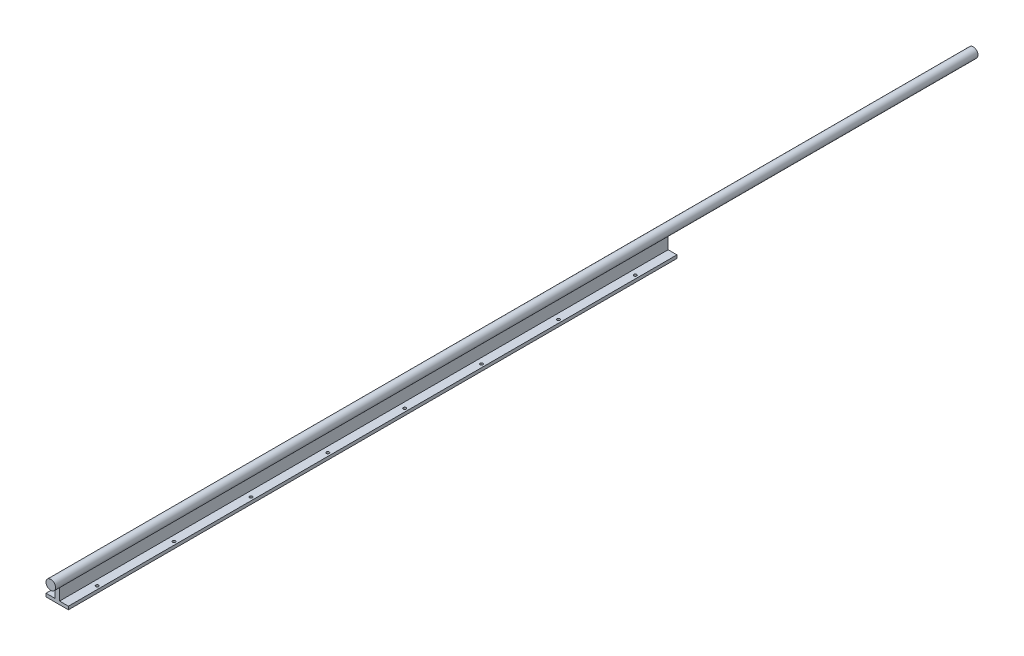
ISO-10303-21;
HEADER;
FILE_DESCRIPTION(('STEP AP214'),'2;1');
FILE_NAME('part.step','',(''),(''),'','','');
FILE_SCHEMA(('AUTOMOTIVE_DESIGN { 1 0 10303 214 1 1 1 1 }'));
ENDSEC;
DATA;
#1=APPLICATION_CONTEXT('core data for automotive mechanical design processes');
#2=APPLICATION_PROTOCOL_DEFINITION('international standard','automotive_design',2000,#1);
#3=PRODUCT_CONTEXT('',#1,'mechanical');
#4=PRODUCT('Part','Part','',(#3));
#5=PRODUCT_RELATED_PRODUCT_CATEGORY('part','',(#4));
#6=PRODUCT_DEFINITION_FORMATION('','',#4);
#7=PRODUCT_DEFINITION_CONTEXT('part definition',#1,'design');
#8=PRODUCT_DEFINITION('design','',#6,#7);
#9=PRODUCT_DEFINITION_SHAPE('','',#8);
#10=(LENGTH_UNIT() NAMED_UNIT(*) SI_UNIT(.MILLI.,.METRE.));
#11=(NAMED_UNIT(*) PLANE_ANGLE_UNIT() SI_UNIT($,.RADIAN.));
#12=(NAMED_UNIT(*) SI_UNIT($,.STERADIAN.) SOLID_ANGLE_UNIT());
#13=UNCERTAINTY_MEASURE_WITH_UNIT(LENGTH_MEASURE(1.E-05),#10,'distance_accuracy_value','');
#14=(GEOMETRIC_REPRESENTATION_CONTEXT(3) GLOBAL_UNCERTAINTY_ASSIGNED_CONTEXT((#13)) GLOBAL_UNIT_ASSIGNED_CONTEXT((#10,
#11,#12)) REPRESENTATION_CONTEXT('',''));
#15=CARTESIAN_POINT('',(0.,0.,0.));
#16=DIRECTION('',(0.,0.,1.));
#17=DIRECTION('',(1.,0.,0.));
#18=AXIS2_PLACEMENT_3D('',#15,#16,#17);
#19=CARTESIAN_POINT('',(0.,0.,0.));
#20=DIRECTION('',(0.,0.,1.));
#21=DIRECTION('',(1.,0.,0.));
#22=AXIS2_PLACEMENT_3D('',#19,#20,#21);
#23=PLANE('',#22);
#24=CARTESIAN_POINT('',(0.,0.,0.));
#25=DIRECTION('',(0.,0.,-1.));
#26=DIRECTION('',(-1.,0.,0.));
#27=AXIS2_PLACEMENT_3D('',#24,#25,#26);
#28=CIRCLE('',#27,9.525);
#29=CARTESIAN_POINT('',(4.7625,-8.24889197104678,0.));
#30=VERTEX_POINT('',#29);
#31=CARTESIAN_POINT('',(-4.76250000000001,-8.24889197104677,0.));
#32=VERTEX_POINT('',#31);
#33=EDGE_CURVE('E127',#30,#32,#28,.T.);
#34=ORIENTED_EDGE('',*,*,#33,.F.);
#35=DIRECTION('',(0.,1.,0.));
#36=VECTOR('',#35,1.);
#37=CARTESIAN_POINT('',(4.7625,-31.75,0.));
#38=LINE('',#37,#36);
#39=CARTESIAN_POINT('',(4.7625,-31.75,0.));
#40=VERTEX_POINT('',#39);
#41=EDGE_CURVE('E131',#40,#30,#38,.T.);
#42=ORIENTED_EDGE('',*,*,#41,.F.);
#43=DIRECTION('',(-1.,0.,0.));
#44=VECTOR('',#43,1.);
#45=CARTESIAN_POINT('',(22.225,-31.75,0.));
#46=LINE('',#45,#44);
#47=CARTESIAN_POINT('',(22.225,-31.75,0.));
#48=VERTEX_POINT('',#47);
#49=EDGE_CURVE('E153',#48,#40,#46,.T.);
#50=ORIENTED_EDGE('',*,*,#49,.F.);
#51=DIRECTION('',(0.,1.,0.));
#52=VECTOR('',#51,1.);
#53=CARTESIAN_POINT('',(22.225,-38.1,0.));
#54=LINE('',#53,#52);
#55=CARTESIAN_POINT('',(22.225,-38.1,0.));
#56=VERTEX_POINT('',#55);
#57=EDGE_CURVE('E156',#56,#48,#54,.T.);
#58=ORIENTED_EDGE('',*,*,#57,.F.);
#59=DIRECTION('',(1.,0.,0.));
#60=VECTOR('',#59,1.);
#61=CARTESIAN_POINT('',(-22.225,-38.1,0.));
#62=LINE('',#61,#60);
#63=CARTESIAN_POINT('',(-22.225,-38.1,0.));
#64=VERTEX_POINT('',#63);
#65=EDGE_CURVE('E209',#64,#56,#62,.T.);
#66=ORIENTED_EDGE('',*,*,#65,.F.);
#67=DIRECTION('',(0.,-1.,0.));
#68=VECTOR('',#67,1.);
#69=CARTESIAN_POINT('',(-22.225,-38.1,0.));
#70=LINE('',#69,#68);
#71=CARTESIAN_POINT('',(-22.225,-31.75,0.));
#72=VERTEX_POINT('',#71);
#73=EDGE_CURVE('E207',#72,#64,#70,.T.);
#74=ORIENTED_EDGE('',*,*,#73,.F.);
#75=DIRECTION('',(-1.,0.,0.));
#76=VECTOR('',#75,1.);
#77=CARTESIAN_POINT('',(-22.225,-31.75,0.));
#78=LINE('',#77,#76);
#79=CARTESIAN_POINT('',(-4.7625,-31.75,0.));
#80=VERTEX_POINT('',#79);
#81=EDGE_CURVE('E154',#80,#72,#78,.T.);
#82=ORIENTED_EDGE('',*,*,#81,.F.);
#83=DIRECTION('',(0.,-1.,0.));
#84=VECTOR('',#83,1.);
#85=CARTESIAN_POINT('',(-4.7625,-31.75,0.));
#86=LINE('',#85,#84);
#87=EDGE_CURVE('E133',#32,#80,#86,.T.);
#88=ORIENTED_EDGE('',*,*,#87,.F.);
#89=EDGE_LOOP('',(#34,#42,#50,#58,#66,#74,#82,#88));
#90=FACE_BOUND('',#89,.T.);
#91=ADVANCED_FACE('F58',(#90),#23,.F.);
#92=CARTESIAN_POINT('',(-22.225,-38.1,1219.2));
#93=DIRECTION('',(1.,0.,0.));
#94=DIRECTION('',(0.,1.,0.));
#95=AXIS2_PLACEMENT_3D('',#92,#93,#94);
#96=PLANE('',#95);
#97=DIRECTION('',(0.,-1.,0.));
#98=VECTOR('',#97,1.);
#99=CARTESIAN_POINT('',(-22.225,-38.1,1206.5));
#100=LINE('',#99,#98);
#101=CARTESIAN_POINT('',(-22.225,-31.75,1206.5));
#102=VERTEX_POINT('',#101);
#103=CARTESIAN_POINT('',(-22.225,-38.1,1206.5));
#104=VERTEX_POINT('',#103);
#105=EDGE_CURVE('E173',#102,#104,#100,.T.);
#106=ORIENTED_EDGE('',*,*,#105,.F.);
#107=DIRECTION('',(0.,0.,-1.));
#108=VECTOR('',#107,1.);
#109=CARTESIAN_POINT('',(-22.225,-31.75,1219.2));
#110=LINE('',#109,#108);
#111=EDGE_CURVE('E75',#102,#72,#110,.T.);
#112=ORIENTED_EDGE('',*,*,#111,.T.);
#113=ORIENTED_EDGE('',*,*,#73,.T.);
#114=DIRECTION('',(0.,0.,-1.));
#115=VECTOR('',#114,1.);
#116=CARTESIAN_POINT('',(-22.225,-38.1,1219.2));
#117=LINE('',#116,#115);
#118=EDGE_CURVE('E225',#104,#64,#117,.T.);
#119=ORIENTED_EDGE('',*,*,#118,.F.);
#120=EDGE_LOOP('',(#106,#112,#113,#119));
#121=FACE_BOUND('',#120,.T.);
#122=ADVANCED_FACE('F303',(#121),#96,.F.);
#123=CARTESIAN_POINT('',(-22.225,-38.1,1219.2));
#124=DIRECTION('',(0.,1.,0.));
#125=DIRECTION('',(0.,0.,1.));
#126=AXIS2_PLACEMENT_3D('',#123,#124,#125);
#127=PLANE('',#126);
#128=CARTESIAN_POINT('',(15.875,-38.1,1143.));
#129=DIRECTION('',(0.,-1.,0.));
#130=DIRECTION('',(0.,0.,-1.));
#131=AXIS2_PLACEMENT_3D('',#128,#129,#130);
#132=CIRCLE('',#131,2.80669999999999);
#133=CARTESIAN_POINT('',(15.875,-38.1,1140.1933));
#134=VERTEX_POINT('',#133);
#135=EDGE_CURVE('E67',#134,#134,#132,.T.);
#136=ORIENTED_EDGE('',*,*,#135,.F.);
#137=EDGE_LOOP('',(#136));
#138=FACE_BOUND('',#137,.T.);
#139=CARTESIAN_POINT('',(15.875,-38.1,990.6));
#140=DIRECTION('',(0.,-1.,0.));
#141=DIRECTION('',(0.,0.,-1.));
#142=AXIS2_PLACEMENT_3D('',#139,#140,#141);
#143=CIRCLE('',#142,2.80669999999999);
#144=CARTESIAN_POINT('',(15.875,-38.1,987.7933));
#145=VERTEX_POINT('',#144);
#146=EDGE_CURVE('E290',#145,#145,#143,.T.);
#147=ORIENTED_EDGE('',*,*,#146,.F.);
#148=EDGE_LOOP('',(#147));
#149=FACE_BOUND('',#148,.T.);
#150=CARTESIAN_POINT('',(15.875,-38.1,838.2));
#151=DIRECTION('',(0.,-1.,0.));
#152=DIRECTION('',(0.,0.,-1.));
#153=AXIS2_PLACEMENT_3D('',#150,#151,#152);
#154=CIRCLE('',#153,2.80669999999999);
#155=CARTESIAN_POINT('',(15.875,-38.1,835.3933));
#156=VERTEX_POINT('',#155);
#157=EDGE_CURVE('E284',#156,#156,#154,.T.);
#158=ORIENTED_EDGE('',*,*,#157,.F.);
#159=EDGE_LOOP('',(#158));
#160=FACE_BOUND('',#159,.T.);
#161=CARTESIAN_POINT('',(15.875,-38.1,685.8));
#162=DIRECTION('',(0.,-1.,0.));
#163=DIRECTION('',(0.,0.,-1.));
#164=AXIS2_PLACEMENT_3D('',#161,#162,#163);
#165=CIRCLE('',#164,2.80669999999999);
#166=CARTESIAN_POINT('',(15.875,-38.1,682.9933));
#167=VERTEX_POINT('',#166);
#168=EDGE_CURVE('E278',#167,#167,#165,.T.);
#169=ORIENTED_EDGE('',*,*,#168,.F.);
#170=EDGE_LOOP('',(#169));
#171=FACE_BOUND('',#170,.T.);
#172=CARTESIAN_POINT('',(15.875,-38.1,533.4));
#173=DIRECTION('',(0.,-1.,0.));
#174=DIRECTION('',(0.,0.,-1.));
#175=AXIS2_PLACEMENT_3D('',#172,#173,#174);
#176=CIRCLE('',#175,2.80669999999999);
#177=CARTESIAN_POINT('',(15.875,-38.1,530.5933));
#178=VERTEX_POINT('',#177);
#179=EDGE_CURVE('E272',#178,#178,#176,.T.);
#180=ORIENTED_EDGE('',*,*,#179,.F.);
#181=EDGE_LOOP('',(#180));
#182=FACE_BOUND('',#181,.T.);
#183=CARTESIAN_POINT('',(15.875,-38.1,381.));
#184=DIRECTION('',(0.,-1.,0.));
#185=DIRECTION('',(0.,0.,-1.));
#186=AXIS2_PLACEMENT_3D('',#183,#184,#185);
#187=CIRCLE('',#186,2.80669999999999);
#188=CARTESIAN_POINT('',(15.875,-38.1,378.1933));
#189=VERTEX_POINT('',#188);
#190=EDGE_CURVE('E266',#189,#189,#187,.T.);
#191=ORIENTED_EDGE('',*,*,#190,.F.);
#192=EDGE_LOOP('',(#191));
#193=FACE_BOUND('',#192,.T.);
#194=CARTESIAN_POINT('',(-15.875,-38.1,1143.));
#195=DIRECTION('',(0.,-1.,0.));
#196=DIRECTION('',(0.,0.,-1.));
#197=AXIS2_PLACEMENT_3D('',#194,#195,#196);
#198=CIRCLE('',#197,2.80669999999999);
#199=CARTESIAN_POINT('',(-15.875,-38.1,1140.1933));
#200=VERTEX_POINT('',#199);
#201=EDGE_CURVE('E260',#200,#200,#198,.T.);
#202=ORIENTED_EDGE('',*,*,#201,.F.);
#203=EDGE_LOOP('',(#202));
#204=FACE_BOUND('',#203,.T.);
#205=CARTESIAN_POINT('',(-15.875,-38.1,990.6));
#206=DIRECTION('',(0.,-1.,0.));
#207=DIRECTION('',(0.,0.,-1.));
#208=AXIS2_PLACEMENT_3D('',#205,#206,#207);
#209=CIRCLE('',#208,2.80669999999999);
#210=CARTESIAN_POINT('',(-15.875,-38.1,987.7933));
#211=VERTEX_POINT('',#210);
#212=EDGE_CURVE('E254',#211,#211,#209,.T.);
#213=ORIENTED_EDGE('',*,*,#212,.F.);
#214=EDGE_LOOP('',(#213));
#215=FACE_BOUND('',#214,.T.);
#216=CARTESIAN_POINT('',(-15.875,-38.1,838.2));
#217=DIRECTION('',(0.,-1.,0.));
#218=DIRECTION('',(0.,0.,-1.));
#219=AXIS2_PLACEMENT_3D('',#216,#217,#218);
#220=CIRCLE('',#219,2.80669999999999);
#221=CARTESIAN_POINT('',(-15.875,-38.1,835.3933));
#222=VERTEX_POINT('',#221);
#223=EDGE_CURVE('E248',#222,#222,#220,.T.);
#224=ORIENTED_EDGE('',*,*,#223,.F.);
#225=EDGE_LOOP('',(#224));
#226=FACE_BOUND('',#225,.T.);
#227=CARTESIAN_POINT('',(-15.875,-38.1,685.8));
#228=DIRECTION('',(0.,-1.,0.));
#229=DIRECTION('',(0.,0.,-1.));
#230=AXIS2_PLACEMENT_3D('',#227,#228,#229);
#231=CIRCLE('',#230,2.80669999999999);
#232=CARTESIAN_POINT('',(-15.875,-38.1,682.9933));
#233=VERTEX_POINT('',#232);
#234=EDGE_CURVE('E242',#233,#233,#231,.T.);
#235=ORIENTED_EDGE('',*,*,#234,.F.);
#236=EDGE_LOOP('',(#235));
#237=FACE_BOUND('',#236,.T.);
#238=CARTESIAN_POINT('',(-15.875,-38.1,533.4));
#239=DIRECTION('',(0.,-1.,0.));
#240=DIRECTION('',(0.,0.,-1.));
#241=AXIS2_PLACEMENT_3D('',#238,#239,#240);
#242=CIRCLE('',#241,2.80669999999999);
#243=CARTESIAN_POINT('',(-15.875,-38.1,530.5933));
#244=VERTEX_POINT('',#243);
#245=EDGE_CURVE('E236',#244,#244,#242,.T.);
#246=ORIENTED_EDGE('',*,*,#245,.F.);
#247=EDGE_LOOP('',(#246));
#248=FACE_BOUND('',#247,.T.);
#249=CARTESIAN_POINT('',(-15.875,-38.1,381.));
#250=DIRECTION('',(0.,-1.,0.));
#251=DIRECTION('',(0.,0.,-1.));
#252=AXIS2_PLACEMENT_3D('',#249,#250,#251);
#253=CIRCLE('',#252,2.80669999999999);
#254=CARTESIAN_POINT('',(-15.875,-38.1,378.1933));
#255=VERTEX_POINT('',#254);
#256=EDGE_CURVE('E230',#255,#255,#253,.T.);
#257=ORIENTED_EDGE('',*,*,#256,.F.);
#258=EDGE_LOOP('',(#257));
#259=FACE_BOUND('',#258,.T.);
#260=CARTESIAN_POINT('',(15.875,-38.1,76.2));
#261=DIRECTION('',(0.,-1.,0.));
#262=DIRECTION('',(0.,0.,-1.));
#263=AXIS2_PLACEMENT_3D('',#260,#261,#262);
#264=CIRCLE('',#263,2.80669999999999);
#265=CARTESIAN_POINT('',(15.875,-38.1,73.3933));
#266=VERTEX_POINT('',#265);
#267=EDGE_CURVE('E201',#266,#266,#264,.T.);
#268=ORIENTED_EDGE('',*,*,#267,.F.);
#269=EDGE_LOOP('',(#268));
#270=FACE_BOUND('',#269,.T.);
#271=CARTESIAN_POINT('',(-15.875,-38.1,76.2));
#272=DIRECTION('',(0.,-1.,0.));
#273=DIRECTION('',(0.,0.,-1.));
#274=AXIS2_PLACEMENT_3D('',#271,#272,#273);
#275=CIRCLE('',#274,2.80669999999999);
#276=CARTESIAN_POINT('',(-15.875,-38.1,73.3933));
#277=VERTEX_POINT('',#276);
#278=EDGE_CURVE('E195',#277,#277,#275,.T.);
#279=ORIENTED_EDGE('',*,*,#278,.F.);
#280=EDGE_LOOP('',(#279));
#281=FACE_BOUND('',#280,.T.);
#282=CARTESIAN_POINT('',(-15.875,-38.1,228.6));
#283=DIRECTION('',(0.,-1.,0.));
#284=DIRECTION('',(0.,0.,-1.));
#285=AXIS2_PLACEMENT_3D('',#282,#283,#284);
#286=CIRCLE('',#285,2.80669999999999);
#287=CARTESIAN_POINT('',(-15.875,-38.1,225.7933));
#288=VERTEX_POINT('',#287);
#289=EDGE_CURVE('E192',#288,#288,#286,.T.);
#290=ORIENTED_EDGE('',*,*,#289,.F.);
#291=EDGE_LOOP('',(#290));
#292=FACE_BOUND('',#291,.T.);
#293=CARTESIAN_POINT('',(15.875,-38.1,228.6));
#294=DIRECTION('',(0.,-1.,0.));
#295=DIRECTION('',(0.,0.,-1.));
#296=AXIS2_PLACEMENT_3D('',#293,#294,#295);
#297=CIRCLE('',#296,2.80669999999999);
#298=CARTESIAN_POINT('',(15.875,-38.1,225.7933));
#299=VERTEX_POINT('',#298);
#300=EDGE_CURVE('E186',#299,#299,#297,.T.);
#301=ORIENTED_EDGE('',*,*,#300,.F.);
#302=EDGE_LOOP('',(#301));
#303=FACE_BOUND('',#302,.T.);
#304=DIRECTION('',(1.,0.,0.));
#305=VECTOR('',#304,1.);
#306=CARTESIAN_POINT('',(-22.225,-38.1,1206.5));
#307=LINE('',#306,#305);
#308=CARTESIAN_POINT('',(22.225,-38.1,1206.5));
#309=VERTEX_POINT('',#308);
#310=EDGE_CURVE('E175',#104,#309,#307,.T.);
#311=ORIENTED_EDGE('',*,*,#310,.F.);
#312=ORIENTED_EDGE('',*,*,#118,.T.);
#313=ORIENTED_EDGE('',*,*,#65,.T.);
#314=DIRECTION('',(0.,0.,-1.));
#315=VECTOR('',#314,1.);
#316=CARTESIAN_POINT('',(22.225,-38.1,1219.2));
#317=LINE('',#316,#315);
#318=EDGE_CURVE('E223',#309,#56,#317,.T.);
#319=ORIENTED_EDGE('',*,*,#318,.F.);
#320=EDGE_LOOP('',(#311,#312,#313,#319));
#321=FACE_BOUND('',#320,.T.);
#322=ADVANCED_FACE('F299',(#138,#149,#160,#171,#182,#193,#204,#215,#226,#237,#248,#259,#270,
#281,#292,#303,#321),#127,.F.);
#323=CARTESIAN_POINT('',(22.225,-38.1,1219.2));
#324=DIRECTION('',(-1.,0.,0.));
#325=DIRECTION('',(0.,-1.,0.));
#326=AXIS2_PLACEMENT_3D('',#323,#324,#325);
#327=PLANE('',#326);
#328=DIRECTION('',(0.,1.,0.));
#329=VECTOR('',#328,1.);
#330=CARTESIAN_POINT('',(22.225,-38.1,1206.5));
#331=LINE('',#330,#329);
#332=CARTESIAN_POINT('',(22.225,-31.75,1206.5));
#333=VERTEX_POINT('',#332);
#334=EDGE_CURVE('E177',#309,#333,#331,.T.);
#335=ORIENTED_EDGE('',*,*,#334,.F.);
#336=ORIENTED_EDGE('',*,*,#318,.T.);
#337=ORIENTED_EDGE('',*,*,#57,.T.);
#338=DIRECTION('',(0.,0.,-1.));
#339=VECTOR('',#338,1.);
#340=CARTESIAN_POINT('',(22.225,-31.75,1219.2));
#341=LINE('',#340,#339);
#342=EDGE_CURVE('E221',#333,#48,#341,.T.);
#343=ORIENTED_EDGE('',*,*,#342,.F.);
#344=EDGE_LOOP('',(#335,#336,#337,#343));
#345=FACE_BOUND('',#344,.T.);
#346=ADVANCED_FACE('F302',(#345),#327,.F.);
#347=CARTESIAN_POINT('',(22.225,-31.75,1219.2));
#348=DIRECTION('',(0.,-1.,0.));
#349=DIRECTION('',(0.,0.,-1.));
#350=AXIS2_PLACEMENT_3D('',#347,#348,#349);
#351=PLANE('',#350);
#352=CARTESIAN_POINT('',(15.875,-31.75,1143.));
#353=DIRECTION('',(0.,-1.,0.));
#354=DIRECTION('',(0.,0.,-1.));
#355=AXIS2_PLACEMENT_3D('',#352,#353,#354);
#356=CIRCLE('',#355,2.80669999999999);
#357=CARTESIAN_POINT('',(15.875,-31.75,1140.1933));
#358=VERTEX_POINT('',#357);
#359=EDGE_CURVE('E293',#358,#358,#356,.T.);
#360=ORIENTED_EDGE('',*,*,#359,.T.);
#361=EDGE_LOOP('',(#360));
#362=FACE_BOUND('',#361,.T.);
#363=CARTESIAN_POINT('',(15.875,-31.75,990.6));
#364=DIRECTION('',(0.,-1.,0.));
#365=DIRECTION('',(0.,0.,-1.));
#366=AXIS2_PLACEMENT_3D('',#363,#364,#365);
#367=CIRCLE('',#366,2.80669999999999);
#368=CARTESIAN_POINT('',(15.875,-31.75,987.7933));
#369=VERTEX_POINT('',#368);
#370=EDGE_CURVE('E287',#369,#369,#367,.T.);
#371=ORIENTED_EDGE('',*,*,#370,.T.);
#372=EDGE_LOOP('',(#371));
#373=FACE_BOUND('',#372,.T.);
#374=CARTESIAN_POINT('',(15.875,-31.75,838.2));
#375=DIRECTION('',(0.,-1.,0.));
#376=DIRECTION('',(0.,0.,-1.));
#377=AXIS2_PLACEMENT_3D('',#374,#375,#376);
#378=CIRCLE('',#377,2.80669999999999);
#379=CARTESIAN_POINT('',(15.875,-31.75,835.3933));
#380=VERTEX_POINT('',#379);
#381=EDGE_CURVE('E281',#380,#380,#378,.T.);
#382=ORIENTED_EDGE('',*,*,#381,.T.);
#383=EDGE_LOOP('',(#382));
#384=FACE_BOUND('',#383,.T.);
#385=CARTESIAN_POINT('',(15.875,-31.75,685.8));
#386=DIRECTION('',(0.,-1.,0.));
#387=DIRECTION('',(0.,0.,-1.));
#388=AXIS2_PLACEMENT_3D('',#385,#386,#387);
#389=CIRCLE('',#388,2.80669999999999);
#390=CARTESIAN_POINT('',(15.875,-31.75,682.9933));
#391=VERTEX_POINT('',#390);
#392=EDGE_CURVE('E275',#391,#391,#389,.T.);
#393=ORIENTED_EDGE('',*,*,#392,.T.);
#394=EDGE_LOOP('',(#393));
#395=FACE_BOUND('',#394,.T.);
#396=CARTESIAN_POINT('',(15.875,-31.75,533.4));
#397=DIRECTION('',(0.,-1.,0.));
#398=DIRECTION('',(0.,0.,-1.));
#399=AXIS2_PLACEMENT_3D('',#396,#397,#398);
#400=CIRCLE('',#399,2.80669999999999);
#401=CARTESIAN_POINT('',(15.875,-31.75,530.5933));
#402=VERTEX_POINT('',#401);
#403=EDGE_CURVE('E269',#402,#402,#400,.T.);
#404=ORIENTED_EDGE('',*,*,#403,.T.);
#405=EDGE_LOOP('',(#404));
#406=FACE_BOUND('',#405,.T.);
#407=CARTESIAN_POINT('',(15.875,-31.75,381.));
#408=DIRECTION('',(0.,-1.,0.));
#409=DIRECTION('',(0.,0.,-1.));
#410=AXIS2_PLACEMENT_3D('',#407,#408,#409);
#411=CIRCLE('',#410,2.80669999999999);
#412=CARTESIAN_POINT('',(15.875,-31.75,378.1933));
#413=VERTEX_POINT('',#412);
#414=EDGE_CURVE('E263',#413,#413,#411,.T.);
#415=ORIENTED_EDGE('',*,*,#414,.T.);
#416=EDGE_LOOP('',(#415));
#417=FACE_BOUND('',#416,.T.);
#418=CARTESIAN_POINT('',(15.875,-31.75,76.2));
#419=DIRECTION('',(0.,-1.,0.));
#420=DIRECTION('',(0.,0.,-1.));
#421=AXIS2_PLACEMENT_3D('',#418,#419,#420);
#422=CIRCLE('',#421,2.80669999999999);
#423=CARTESIAN_POINT('',(15.875,-31.75,73.3933));
#424=VERTEX_POINT('',#423);
#425=EDGE_CURVE('E204',#424,#424,#422,.T.);
#426=ORIENTED_EDGE('',*,*,#425,.T.);
#427=EDGE_LOOP('',(#426));
#428=FACE_BOUND('',#427,.T.);
#429=CARTESIAN_POINT('',(15.875,-31.75,228.6));
#430=DIRECTION('',(0.,-1.,0.));
#431=DIRECTION('',(0.,0.,-1.));
#432=AXIS2_PLACEMENT_3D('',#429,#430,#431);
#433=CIRCLE('',#432,2.80669999999999);
#434=CARTESIAN_POINT('',(15.875,-31.75,225.7933));
#435=VERTEX_POINT('',#434);
#436=EDGE_CURVE('E183',#435,#435,#433,.T.);
#437=ORIENTED_EDGE('',*,*,#436,.T.);
#438=EDGE_LOOP('',(#437));
#439=FACE_BOUND('',#438,.T.);
#440=DIRECTION('',(-1.,0.,0.));
#441=VECTOR('',#440,1.);
#442=CARTESIAN_POINT('',(22.225,-31.75,1206.5));
#443=LINE('',#442,#441);
#444=CARTESIAN_POINT('',(4.7625,-31.75,1206.5));
#445=VERTEX_POINT('',#444);
#446=EDGE_CURVE('E179',#333,#445,#443,.T.);
#447=ORIENTED_EDGE('',*,*,#446,.F.);
#448=ORIENTED_EDGE('',*,*,#342,.T.);
#449=ORIENTED_EDGE('',*,*,#49,.T.);
#450=DIRECTION('',(0.,0.,-1.));
#451=VECTOR('',#450,1.);
#452=CARTESIAN_POINT('',(4.7625,-31.75,1219.2));
#453=LINE('',#452,#451);
#454=EDGE_CURVE('E147',#445,#40,#453,.T.);
#455=ORIENTED_EDGE('',*,*,#454,.F.);
#456=EDGE_LOOP('',(#447,#448,#449,#455));
#457=FACE_BOUND('',#456,.T.);
#458=ADVANCED_FACE('F348',(#362,#373,#384,#395,#406,#417,#428,#439,#457),#351,.F.);
#459=CARTESIAN_POINT('',(4.7625,-31.75,1219.2));
#460=DIRECTION('',(-1.,0.,0.));
#461=DIRECTION('',(0.,0.,1.));
#462=AXIS2_PLACEMENT_3D('',#459,#460,#461);
#463=PLANE('',#462);
#464=DIRECTION('',(0.,1.,0.));
#465=VECTOR('',#464,1.);
#466=CARTESIAN_POINT('',(4.7625,-31.75,1206.5));
#467=LINE('',#466,#465);
#468=CARTESIAN_POINT('',(4.7625,-8.24889197104678,1206.5));
#469=VERTEX_POINT('',#468);
#470=EDGE_CURVE('E181',#445,#469,#467,.T.);
#471=ORIENTED_EDGE('',*,*,#470,.F.);
#472=ORIENTED_EDGE('',*,*,#454,.T.);
#473=ORIENTED_EDGE('',*,*,#41,.T.);
#474=DIRECTION('',(0.,0.,-1.));
#475=VECTOR('',#474,1.);
#476=CARTESIAN_POINT('',(4.7625,-8.24889197104678,1219.2));
#477=LINE('',#476,#475);
#478=EDGE_CURVE('E141',#469,#30,#477,.T.);
#479=ORIENTED_EDGE('',*,*,#478,.F.);
#480=EDGE_LOOP('',(#471,#472,#473,#479));
#481=FACE_BOUND('',#480,.T.);
#482=ADVANCED_FACE('F150',(#481),#463,.F.);
#483=CARTESIAN_POINT('',(-4.7625,-31.75,1219.2));
#484=DIRECTION('',(1.,0.,0.));
#485=DIRECTION('',(0.,0.,-1.));
#486=AXIS2_PLACEMENT_3D('',#483,#484,#485);
#487=PLANE('',#486);
#488=DIRECTION('',(0.,-1.,0.));
#489=VECTOR('',#488,1.);
#490=CARTESIAN_POINT('',(-4.7625,-31.75,1206.5));
#491=LINE('',#490,#489);
#492=CARTESIAN_POINT('',(-4.7625,-8.24889197104678,1206.5));
#493=VERTEX_POINT('',#492);
#494=CARTESIAN_POINT('',(-4.7625,-31.75,1206.5));
#495=VERTEX_POINT('',#494);
#496=EDGE_CURVE('E171',#493,#495,#491,.T.);
#497=ORIENTED_EDGE('',*,*,#496,.F.);
#498=DIRECTION('',(0.,0.,-1.));
#499=VECTOR('',#498,1.);
#500=CARTESIAN_POINT('',(-4.76250000000001,-8.24889197104677,1219.2));
#501=LINE('',#500,#499);
#502=EDGE_CURVE('E148',#493,#32,#501,.T.);
#503=ORIENTED_EDGE('',*,*,#502,.T.);
#504=ORIENTED_EDGE('',*,*,#87,.T.);
#505=DIRECTION('',(0.,0.,-1.));
#506=VECTOR('',#505,1.);
#507=CARTESIAN_POINT('',(-4.7625,-31.75,1219.2));
#508=LINE('',#507,#506);
#509=EDGE_CURVE('E82',#495,#80,#508,.T.);
#510=ORIENTED_EDGE('',*,*,#509,.F.);
#511=EDGE_LOOP('',(#497,#503,#504,#510));
#512=FACE_BOUND('',#511,.T.);
#513=ADVANCED_FACE('F356',(#512),#487,.F.);
#514=CARTESIAN_POINT('',(-22.225,-31.75,1219.2));
#515=DIRECTION('',(0.,-1.,0.));
#516=DIRECTION('',(0.,0.,-1.));
#517=AXIS2_PLACEMENT_3D('',#514,#515,#516);
#518=PLANE('',#517);
#519=CARTESIAN_POINT('',(-15.875,-31.75,1143.));
#520=DIRECTION('',(0.,-1.,0.));
#521=DIRECTION('',(0.,0.,-1.));
#522=AXIS2_PLACEMENT_3D('',#519,#520,#521);
#523=CIRCLE('',#522,2.80669999999999);
#524=CARTESIAN_POINT('',(-15.875,-31.75,1140.1933));
#525=VERTEX_POINT('',#524);
#526=EDGE_CURVE('E257',#525,#525,#523,.T.);
#527=ORIENTED_EDGE('',*,*,#526,.T.);
#528=EDGE_LOOP('',(#527));
#529=FACE_BOUND('',#528,.T.);
#530=CARTESIAN_POINT('',(-15.875,-31.75,990.6));
#531=DIRECTION('',(0.,-1.,0.));
#532=DIRECTION('',(0.,0.,-1.));
#533=AXIS2_PLACEMENT_3D('',#530,#531,#532);
#534=CIRCLE('',#533,2.80669999999999);
#535=CARTESIAN_POINT('',(-15.875,-31.75,987.7933));
#536=VERTEX_POINT('',#535);
#537=EDGE_CURVE('E251',#536,#536,#534,.T.);
#538=ORIENTED_EDGE('',*,*,#537,.T.);
#539=EDGE_LOOP('',(#538));
#540=FACE_BOUND('',#539,.T.);
#541=CARTESIAN_POINT('',(-15.875,-31.75,838.2));
#542=DIRECTION('',(0.,-1.,0.));
#543=DIRECTION('',(0.,0.,-1.));
#544=AXIS2_PLACEMENT_3D('',#541,#542,#543);
#545=CIRCLE('',#544,2.80669999999999);
#546=CARTESIAN_POINT('',(-15.875,-31.75,835.3933));
#547=VERTEX_POINT('',#546);
#548=EDGE_CURVE('E245',#547,#547,#545,.T.);
#549=ORIENTED_EDGE('',*,*,#548,.T.);
#550=EDGE_LOOP('',(#549));
#551=FACE_BOUND('',#550,.T.);
#552=CARTESIAN_POINT('',(-15.875,-31.75,685.8));
#553=DIRECTION('',(0.,-1.,0.));
#554=DIRECTION('',(0.,0.,-1.));
#555=AXIS2_PLACEMENT_3D('',#552,#553,#554);
#556=CIRCLE('',#555,2.80669999999999);
#557=CARTESIAN_POINT('',(-15.875,-31.75,682.9933));
#558=VERTEX_POINT('',#557);
#559=EDGE_CURVE('E239',#558,#558,#556,.T.);
#560=ORIENTED_EDGE('',*,*,#559,.T.);
#561=EDGE_LOOP('',(#560));
#562=FACE_BOUND('',#561,.T.);
#563=CARTESIAN_POINT('',(-15.875,-31.75,533.4));
#564=DIRECTION('',(0.,-1.,0.));
#565=DIRECTION('',(0.,0.,-1.));
#566=AXIS2_PLACEMENT_3D('',#563,#564,#565);
#567=CIRCLE('',#566,2.80669999999999);
#568=CARTESIAN_POINT('',(-15.875,-31.75,530.5933));
#569=VERTEX_POINT('',#568);
#570=EDGE_CURVE('E233',#569,#569,#567,.T.);
#571=ORIENTED_EDGE('',*,*,#570,.T.);
#572=EDGE_LOOP('',(#571));
#573=FACE_BOUND('',#572,.T.);
#574=CARTESIAN_POINT('',(-15.875,-31.75,381.));
#575=DIRECTION('',(0.,-1.,0.));
#576=DIRECTION('',(0.,0.,-1.));
#577=AXIS2_PLACEMENT_3D('',#574,#575,#576);
#578=CIRCLE('',#577,2.80669999999999);
#579=CARTESIAN_POINT('',(-15.875,-31.75,378.1933));
#580=VERTEX_POINT('',#579);
#581=EDGE_CURVE('E227',#580,#580,#578,.T.);
#582=ORIENTED_EDGE('',*,*,#581,.T.);
#583=EDGE_LOOP('',(#582));
#584=FACE_BOUND('',#583,.T.);
#585=CARTESIAN_POINT('',(-15.875,-31.75,76.2));
#586=DIRECTION('',(0.,-1.,0.));
#587=DIRECTION('',(0.,0.,-1.));
#588=AXIS2_PLACEMENT_3D('',#585,#586,#587);
#589=CIRCLE('',#588,2.80669999999999);
#590=CARTESIAN_POINT('',(-15.875,-31.75,73.3933));
#591=VERTEX_POINT('',#590);
#592=EDGE_CURVE('E198',#591,#591,#589,.T.);
#593=ORIENTED_EDGE('',*,*,#592,.T.);
#594=EDGE_LOOP('',(#593));
#595=FACE_BOUND('',#594,.T.);
#596=CARTESIAN_POINT('',(-15.875,-31.75,228.6));
#597=DIRECTION('',(0.,-1.,0.));
#598=DIRECTION('',(0.,0.,-1.));
#599=AXIS2_PLACEMENT_3D('',#596,#597,#598);
#600=CIRCLE('',#599,2.80669999999999);
#601=CARTESIAN_POINT('',(-15.875,-31.75,225.7933));
#602=VERTEX_POINT('',#601);
#603=EDGE_CURVE('E189',#602,#602,#600,.T.);
#604=ORIENTED_EDGE('',*,*,#603,.T.);
#605=EDGE_LOOP('',(#604));
#606=FACE_BOUND('',#605,.T.);
#607=DIRECTION('',(-1.,0.,0.));
#608=VECTOR('',#607,1.);
#609=CARTESIAN_POINT('',(-22.225,-31.75,1206.5));
#610=LINE('',#609,#608);
#611=EDGE_CURVE('E14',#495,#102,#610,.T.);
#612=ORIENTED_EDGE('',*,*,#611,.F.);
#613=ORIENTED_EDGE('',*,*,#509,.T.);
#614=ORIENTED_EDGE('',*,*,#81,.T.);
#615=ORIENTED_EDGE('',*,*,#111,.F.);
#616=EDGE_LOOP('',(#612,#613,#614,#615));
#617=FACE_BOUND('',#616,.T.);
#618=ADVANCED_FACE('F373',(#529,#540,#551,#562,#573,#584,#595,#606,#617),#518,.F.);
#619=CARTESIAN_POINT('',(0.,0.,1219.2));
#620=DIRECTION('',(0.,0.,1.));
#621=DIRECTION('',(1.,0.,0.));
#622=AXIS2_PLACEMENT_3D('',#619,#620,#621);
#623=PLANE('',#622);
#624=CARTESIAN_POINT('',(0.,0.,1219.2));
#625=DIRECTION('',(0.,0.,1.));
#626=DIRECTION('',(1.,0.,0.));
#627=AXIS2_PLACEMENT_3D('',#624,#625,#626);
#628=CIRCLE('',#627,9.525);
#629=CARTESIAN_POINT('',(9.525,0.,1219.2));
#630=VERTEX_POINT('',#629);
#631=EDGE_CURVE('E215',#630,#630,#628,.T.);
#632=ORIENTED_EDGE('',*,*,#631,.T.);
#633=EDGE_LOOP('',(#632));
#634=FACE_BOUND('',#633,.T.);
#635=ADVANCED_FACE('F370',(#634),#623,.T.);
#636=CARTESIAN_POINT('',(0.,0.,1219.2));
#637=DIRECTION('',(0.,0.,-1.));
#638=DIRECTION('',(-1.,0.,0.));
#639=AXIS2_PLACEMENT_3D('',#636,#637,#638);
#640=CYLINDRICAL_SURFACE('',#639,9.525);
#641=CARTESIAN_POINT('',(0.,0.,1206.5));
#642=DIRECTION('',(0.,0.,1.));
#643=DIRECTION('',(1.,0.,0.));
#644=AXIS2_PLACEMENT_3D('',#641,#642,#643);
#645=CIRCLE('',#644,9.525);
#646=EDGE_CURVE('E144',#493,#469,#645,.T.);
#647=ORIENTED_EDGE('',*,*,#646,.T.);
#648=ORIENTED_EDGE('',*,*,#478,.T.);
#649=ORIENTED_EDGE('',*,*,#33,.T.);
#650=ORIENTED_EDGE('',*,*,#502,.F.);
#651=EDGE_LOOP('',(#647,#648,#649,#650));
#652=FACE_BOUND('',#651,.T.);
#653=ORIENTED_EDGE('',*,*,#631,.F.);
#654=EDGE_LOOP('',(#653));
#655=FACE_BOUND('',#654,.T.);
#656=CARTESIAN_POINT('',(0.,0.,-609.6));
#657=DIRECTION('',(0.,0.,-1.));
#658=DIRECTION('',(-1.,0.,0.));
#659=AXIS2_PLACEMENT_3D('',#656,#657,#658);
#660=CIRCLE('',#659,9.525);
#661=CARTESIAN_POINT('',(-9.525,0.,-609.6));
#662=VERTEX_POINT('',#661);
#663=EDGE_CURVE('E137',#662,#662,#660,.T.);
#664=ORIENTED_EDGE('',*,*,#663,.F.);
#665=EDGE_LOOP('',(#664));
#666=FACE_BOUND('',#665,.T.);
#667=ADVANCED_FACE('F142',(#652,#655,#666),#640,.T.);
#668=CARTESIAN_POINT('',(15.875,-38.1,76.2));
#669=DIRECTION('',(0.,-1.,0.));
#670=DIRECTION('',(0.,0.,-1.));
#671=AXIS2_PLACEMENT_3D('',#668,#669,#670);
#672=CYLINDRICAL_SURFACE('',#671,2.80669999999999);
#673=ORIENTED_EDGE('',*,*,#425,.F.);
#674=EDGE_LOOP('',(#673));
#675=FACE_BOUND('',#674,.T.);
#676=ORIENTED_EDGE('',*,*,#267,.T.);
#677=EDGE_LOOP('',(#676));
#678=FACE_BOUND('',#677,.T.);
#679=ADVANCED_FACE('F368',(#675,#678),#672,.F.);
#680=CARTESIAN_POINT('',(-15.875,-38.1,76.2));
#681=DIRECTION('',(0.,-1.,0.));
#682=DIRECTION('',(0.,0.,-1.));
#683=AXIS2_PLACEMENT_3D('',#680,#681,#682);
#684=CYLINDRICAL_SURFACE('',#683,2.80669999999999);
#685=ORIENTED_EDGE('',*,*,#592,.F.);
#686=EDGE_LOOP('',(#685));
#687=FACE_BOUND('',#686,.T.);
#688=ORIENTED_EDGE('',*,*,#278,.T.);
#689=EDGE_LOOP('',(#688));
#690=FACE_BOUND('',#689,.T.);
#691=ADVANCED_FACE('F385',(#687,#690),#684,.F.);
#692=CARTESIAN_POINT('',(-15.875,-38.1,228.6));
#693=DIRECTION('',(0.,-1.,0.));
#694=DIRECTION('',(0.,0.,-1.));
#695=AXIS2_PLACEMENT_3D('',#692,#693,#694);
#696=CYLINDRICAL_SURFACE('',#695,2.80669999999999);
#697=ORIENTED_EDGE('',*,*,#603,.F.);
#698=EDGE_LOOP('',(#697));
#699=FACE_BOUND('',#698,.T.);
#700=ORIENTED_EDGE('',*,*,#289,.T.);
#701=EDGE_LOOP('',(#700));
#702=FACE_BOUND('',#701,.T.);
#703=ADVANCED_FACE('F390',(#699,#702),#696,.F.);
#704=CARTESIAN_POINT('',(-15.875,-38.1,381.));
#705=DIRECTION('',(0.,-1.,0.));
#706=DIRECTION('',(0.,0.,-1.));
#707=AXIS2_PLACEMENT_3D('',#704,#705,#706);
#708=CYLINDRICAL_SURFACE('',#707,2.80669999999999);
#709=ORIENTED_EDGE('',*,*,#581,.F.);
#710=EDGE_LOOP('',(#709));
#711=FACE_BOUND('',#710,.T.);
#712=ORIENTED_EDGE('',*,*,#256,.T.);
#713=EDGE_LOOP('',(#712));
#714=FACE_BOUND('',#713,.T.);
#715=ADVANCED_FACE('F418',(#711,#714),#708,.F.);
#716=CARTESIAN_POINT('',(-15.875,-38.1,533.4));
#717=DIRECTION('',(0.,-1.,0.));
#718=DIRECTION('',(0.,0.,-1.));
#719=AXIS2_PLACEMENT_3D('',#716,#717,#718);
#720=CYLINDRICAL_SURFACE('',#719,2.80669999999999);
#721=ORIENTED_EDGE('',*,*,#570,.F.);
#722=EDGE_LOOP('',(#721));
#723=FACE_BOUND('',#722,.T.);
#724=ORIENTED_EDGE('',*,*,#245,.T.);
#725=EDGE_LOOP('',(#724));
#726=FACE_BOUND('',#725,.T.);
#727=ADVANCED_FACE('F423',(#723,#726),#720,.F.);
#728=CARTESIAN_POINT('',(-15.875,-38.1,685.8));
#729=DIRECTION('',(0.,-1.,0.));
#730=DIRECTION('',(0.,0.,-1.));
#731=AXIS2_PLACEMENT_3D('',#728,#729,#730);
#732=CYLINDRICAL_SURFACE('',#731,2.80669999999999);
#733=ORIENTED_EDGE('',*,*,#559,.F.);
#734=EDGE_LOOP('',(#733));
#735=FACE_BOUND('',#734,.T.);
#736=ORIENTED_EDGE('',*,*,#234,.T.);
#737=EDGE_LOOP('',(#736));
#738=FACE_BOUND('',#737,.T.);
#739=ADVANCED_FACE('F433',(#735,#738),#732,.F.);
#740=CARTESIAN_POINT('',(-15.875,-38.1,838.2));
#741=DIRECTION('',(0.,-1.,0.));
#742=DIRECTION('',(0.,0.,-1.));
#743=AXIS2_PLACEMENT_3D('',#740,#741,#742);
#744=CYLINDRICAL_SURFACE('',#743,2.80669999999999);
#745=ORIENTED_EDGE('',*,*,#548,.F.);
#746=EDGE_LOOP('',(#745));
#747=FACE_BOUND('',#746,.T.);
#748=ORIENTED_EDGE('',*,*,#223,.T.);
#749=EDGE_LOOP('',(#748));
#750=FACE_BOUND('',#749,.T.);
#751=ADVANCED_FACE('F441',(#747,#750),#744,.F.);
#752=CARTESIAN_POINT('',(-15.875,-38.1,990.6));
#753=DIRECTION('',(0.,-1.,0.));
#754=DIRECTION('',(0.,0.,-1.));
#755=AXIS2_PLACEMENT_3D('',#752,#753,#754);
#756=CYLINDRICAL_SURFACE('',#755,2.80669999999999);
#757=ORIENTED_EDGE('',*,*,#537,.F.);
#758=EDGE_LOOP('',(#757));
#759=FACE_BOUND('',#758,.T.);
#760=ORIENTED_EDGE('',*,*,#212,.T.);
#761=EDGE_LOOP('',(#760));
#762=FACE_BOUND('',#761,.T.);
#763=ADVANCED_FACE('F411',(#759,#762),#756,.F.);
#764=CARTESIAN_POINT('',(-15.875,-38.1,1143.));
#765=DIRECTION('',(0.,-1.,0.));
#766=DIRECTION('',(0.,0.,-1.));
#767=AXIS2_PLACEMENT_3D('',#764,#765,#766);
#768=CYLINDRICAL_SURFACE('',#767,2.80669999999999);
#769=ORIENTED_EDGE('',*,*,#526,.F.);
#770=EDGE_LOOP('',(#769));
#771=FACE_BOUND('',#770,.T.);
#772=ORIENTED_EDGE('',*,*,#201,.T.);
#773=EDGE_LOOP('',(#772));
#774=FACE_BOUND('',#773,.T.);
#775=ADVANCED_FACE('F402',(#771,#774),#768,.F.);
#776=CARTESIAN_POINT('',(15.875,-38.1,228.6));
#777=DIRECTION('',(0.,-1.,0.));
#778=DIRECTION('',(0.,0.,-1.));
#779=AXIS2_PLACEMENT_3D('',#776,#777,#778);
#780=CYLINDRICAL_SURFACE('',#779,2.80669999999999);
#781=ORIENTED_EDGE('',*,*,#436,.F.);
#782=EDGE_LOOP('',(#781));
#783=FACE_BOUND('',#782,.T.);
#784=ORIENTED_EDGE('',*,*,#300,.T.);
#785=EDGE_LOOP('',(#784));
#786=FACE_BOUND('',#785,.T.);
#787=ADVANCED_FACE('F398',(#783,#786),#780,.F.);
#788=CARTESIAN_POINT('',(15.875,-38.1,381.));
#789=DIRECTION('',(0.,-1.,0.));
#790=DIRECTION('',(0.,0.,-1.));
#791=AXIS2_PLACEMENT_3D('',#788,#789,#790);
#792=CYLINDRICAL_SURFACE('',#791,2.80669999999999);
#793=ORIENTED_EDGE('',*,*,#414,.F.);
#794=EDGE_LOOP('',(#793));
#795=FACE_BOUND('',#794,.T.);
#796=ORIENTED_EDGE('',*,*,#190,.T.);
#797=EDGE_LOOP('',(#796));
#798=FACE_BOUND('',#797,.T.);
#799=ADVANCED_FACE('F401',(#795,#798),#792,.F.);
#800=CARTESIAN_POINT('',(15.875,-38.1,533.4));
#801=DIRECTION('',(0.,-1.,0.));
#802=DIRECTION('',(0.,0.,-1.));
#803=AXIS2_PLACEMENT_3D('',#800,#801,#802);
#804=CYLINDRICAL_SURFACE('',#803,2.80669999999999);
#805=ORIENTED_EDGE('',*,*,#403,.F.);
#806=EDGE_LOOP('',(#805));
#807=FACE_BOUND('',#806,.T.);
#808=ORIENTED_EDGE('',*,*,#179,.T.);
#809=EDGE_LOOP('',(#808));
#810=FACE_BOUND('',#809,.T.);
#811=ADVANCED_FACE('F408',(#807,#810),#804,.F.);
#812=CARTESIAN_POINT('',(15.875,-38.1,685.8));
#813=DIRECTION('',(0.,-1.,0.));
#814=DIRECTION('',(0.,0.,-1.));
#815=AXIS2_PLACEMENT_3D('',#812,#813,#814);
#816=CYLINDRICAL_SURFACE('',#815,2.80669999999999);
#817=ORIENTED_EDGE('',*,*,#392,.F.);
#818=EDGE_LOOP('',(#817));
#819=FACE_BOUND('',#818,.T.);
#820=ORIENTED_EDGE('',*,*,#168,.T.);
#821=EDGE_LOOP('',(#820));
#822=FACE_BOUND('',#821,.T.);
#823=ADVANCED_FACE('F451',(#819,#822),#816,.F.);
#824=CARTESIAN_POINT('',(15.875,-38.1,838.2));
#825=DIRECTION('',(0.,-1.,0.));
#826=DIRECTION('',(0.,0.,-1.));
#827=AXIS2_PLACEMENT_3D('',#824,#825,#826);
#828=CYLINDRICAL_SURFACE('',#827,2.80669999999999);
#829=ORIENTED_EDGE('',*,*,#381,.F.);
#830=EDGE_LOOP('',(#829));
#831=FACE_BOUND('',#830,.T.);
#832=ORIENTED_EDGE('',*,*,#157,.T.);
#833=EDGE_LOOP('',(#832));
#834=FACE_BOUND('',#833,.T.);
#835=ADVANCED_FACE('F455',(#831,#834),#828,.F.);
#836=CARTESIAN_POINT('',(15.875,-38.1,990.6));
#837=DIRECTION('',(0.,-1.,0.));
#838=DIRECTION('',(0.,0.,-1.));
#839=AXIS2_PLACEMENT_3D('',#836,#837,#838);
#840=CYLINDRICAL_SURFACE('',#839,2.80669999999999);
#841=ORIENTED_EDGE('',*,*,#370,.F.);
#842=EDGE_LOOP('',(#841));
#843=FACE_BOUND('',#842,.T.);
#844=ORIENTED_EDGE('',*,*,#146,.T.);
#845=EDGE_LOOP('',(#844));
#846=FACE_BOUND('',#845,.T.);
#847=ADVANCED_FACE('F458',(#843,#846),#840,.F.);
#848=CARTESIAN_POINT('',(15.875,-38.1,1143.));
#849=DIRECTION('',(0.,-1.,0.));
#850=DIRECTION('',(0.,0.,-1.));
#851=AXIS2_PLACEMENT_3D('',#848,#849,#850);
#852=CYLINDRICAL_SURFACE('',#851,2.80669999999999);
#853=ORIENTED_EDGE('',*,*,#359,.F.);
#854=EDGE_LOOP('',(#853));
#855=FACE_BOUND('',#854,.T.);
#856=ORIENTED_EDGE('',*,*,#135,.T.);
#857=EDGE_LOOP('',(#856));
#858=FACE_BOUND('',#857,.T.);
#859=ADVANCED_FACE('F60',(#855,#858),#852,.F.);
#860=CARTESIAN_POINT('',(0.,-14.2875,1206.5));
#861=DIRECTION('',(0.,0.,1.));
#862=DIRECTION('',(1.,0.,0.));
#863=AXIS2_PLACEMENT_3D('',#860,#861,#862);
#864=PLANE('',#863);
#865=ORIENTED_EDGE('',*,*,#470,.T.);
#866=ORIENTED_EDGE('',*,*,#646,.F.);
#867=ORIENTED_EDGE('',*,*,#496,.T.);
#868=ORIENTED_EDGE('',*,*,#611,.T.);
#869=ORIENTED_EDGE('',*,*,#105,.T.);
#870=ORIENTED_EDGE('',*,*,#310,.T.);
#871=ORIENTED_EDGE('',*,*,#334,.T.);
#872=ORIENTED_EDGE('',*,*,#446,.T.);
#873=EDGE_LOOP('',(#865,#866,#867,#868,#869,#870,#871,#872));
#874=FACE_BOUND('',#873,.T.);
#875=ADVANCED_FACE('F346',(#874),#864,.T.);
#876=CARTESIAN_POINT('',(0.,0.,-609.6));
#877=DIRECTION('',(0.,0.,-1.));
#878=DIRECTION('',(-1.,0.,0.));
#879=AXIS2_PLACEMENT_3D('',#876,#877,#878);
#880=PLANE('',#879);
#881=ORIENTED_EDGE('',*,*,#663,.T.);
#882=EDGE_LOOP('',(#881));
#883=FACE_BOUND('',#882,.T.);
#884=ADVANCED_FACE('F483',(#883),#880,.T.);
#885=CLOSED_SHELL('',(#91,#122,#322,#346,#458,#482,#513,#618,#635,#667,#679,#691,#703,#715,#727,
#739,#751,#763,#775,#787,#799,#811,#823,#835,#847,#859,#875,#884));
#886=MANIFOLD_SOLID_BREP('B2',#885);
#887=ADVANCED_BREP_SHAPE_REPRESENTATION('',(#18,#886),#14);
#888=SHAPE_DEFINITION_REPRESENTATION(#9,#887);
ENDSEC;
END-ISO-10303-21;
